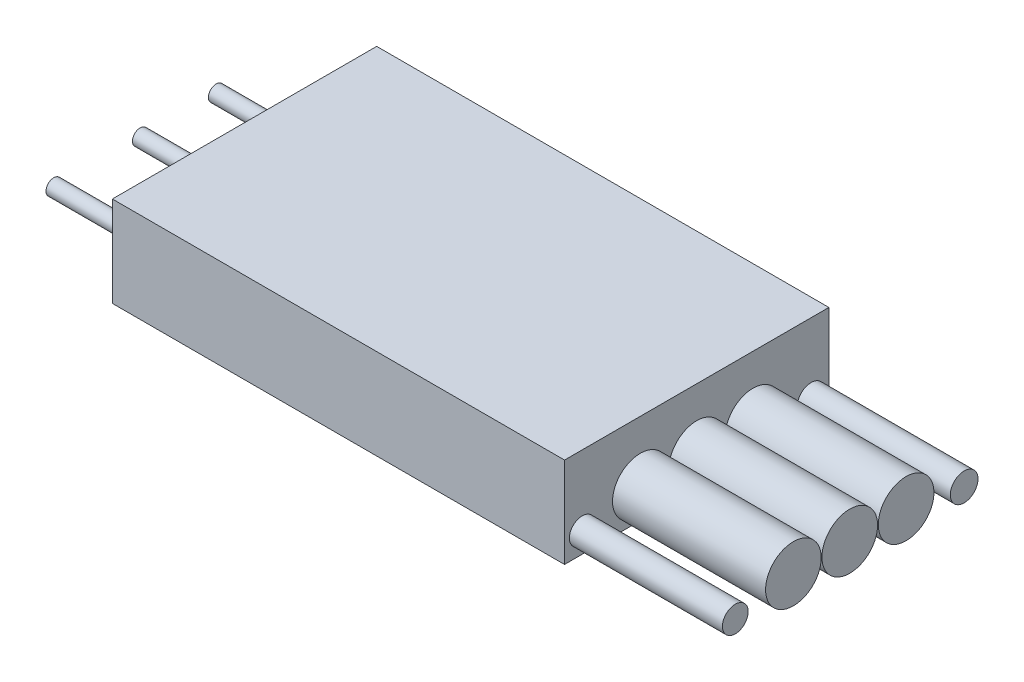
ISO-10303-21;
HEADER;
FILE_DESCRIPTION(('STEP AP214'),'2;1');
FILE_NAME('part.step','',(''),(''),'','','');
FILE_SCHEMA(('AUTOMOTIVE_DESIGN { 1 0 10303 214 1 1 1 1 }'));
ENDSEC;
DATA;
#1=APPLICATION_CONTEXT('core data for automotive mechanical design processes');
#2=APPLICATION_PROTOCOL_DEFINITION('international standard','automotive_design',2000,#1);
#3=PRODUCT_CONTEXT('',#1,'mechanical');
#4=PRODUCT('Part','Part','',(#3));
#5=PRODUCT_RELATED_PRODUCT_CATEGORY('part','',(#4));
#6=PRODUCT_DEFINITION_FORMATION('','',#4);
#7=PRODUCT_DEFINITION_CONTEXT('part definition',#1,'design');
#8=PRODUCT_DEFINITION('design','',#6,#7);
#9=PRODUCT_DEFINITION_SHAPE('','',#8);
#10=(LENGTH_UNIT() NAMED_UNIT(*) SI_UNIT(.MILLI.,.METRE.));
#11=(NAMED_UNIT(*) PLANE_ANGLE_UNIT() SI_UNIT($,.RADIAN.));
#12=(NAMED_UNIT(*) SI_UNIT($,.STERADIAN.) SOLID_ANGLE_UNIT());
#13=UNCERTAINTY_MEASURE_WITH_UNIT(LENGTH_MEASURE(1.E-05),#10,'distance_accuracy_value','');
#14=(GEOMETRIC_REPRESENTATION_CONTEXT(3) GLOBAL_UNCERTAINTY_ASSIGNED_CONTEXT((#13)) GLOBAL_UNIT_ASSIGNED_CONTEXT((#10,
#11,#12)) REPRESENTATION_CONTEXT('',''));
#15=CARTESIAN_POINT('',(0.,0.,0.));
#16=DIRECTION('',(0.,0.,1.));
#17=DIRECTION('',(1.,0.,0.));
#18=AXIS2_PLACEMENT_3D('',#15,#16,#17);
#19=CARTESIAN_POINT('',(65.,6.5,-19.));
#20=DIRECTION('',(0.,0.,-1.));
#21=DIRECTION('',(-1.,0.,0.));
#22=AXIS2_PLACEMENT_3D('',#19,#20,#21);
#23=PLANE('',#22);
#24=DIRECTION('',(0.,-1.,0.));
#25=VECTOR('',#24,1.);
#26=CARTESIAN_POINT('',(0.,6.5,-19.));
#27=LINE('',#26,#25);
#28=CARTESIAN_POINT('',(0.,6.5,-19.));
#29=VERTEX_POINT('',#28);
#30=CARTESIAN_POINT('',(0.,-6.5,-19.));
#31=VERTEX_POINT('',#30);
#32=EDGE_CURVE('E106',#29,#31,#27,.T.);
#33=ORIENTED_EDGE('',*,*,#32,.F.);
#34=DIRECTION('',(-1.,0.,0.));
#35=VECTOR('',#34,1.);
#36=CARTESIAN_POINT('',(65.,6.5,-19.));
#37=LINE('',#36,#35);
#38=CARTESIAN_POINT('',(65.,6.5,-19.));
#39=VERTEX_POINT('',#38);
#40=EDGE_CURVE('E53',#39,#29,#37,.T.);
#41=ORIENTED_EDGE('',*,*,#40,.F.);
#42=DIRECTION('',(0.,-1.,0.));
#43=VECTOR('',#42,1.);
#44=CARTESIAN_POINT('',(65.,6.5,-19.));
#45=LINE('',#44,#43);
#46=CARTESIAN_POINT('',(65.,-6.5,-19.));
#47=VERTEX_POINT('',#46);
#48=EDGE_CURVE('E100',#39,#47,#45,.T.);
#49=ORIENTED_EDGE('',*,*,#48,.T.);
#50=DIRECTION('',(-1.,0.,0.));
#51=VECTOR('',#50,1.);
#52=CARTESIAN_POINT('',(65.,-6.5,-19.));
#53=LINE('',#52,#51);
#54=EDGE_CURVE('E78',#47,#31,#53,.T.);
#55=ORIENTED_EDGE('',*,*,#54,.T.);
#56=EDGE_LOOP('',(#33,#41,#49,#55));
#57=FACE_BOUND('',#56,.T.);
#58=ADVANCED_FACE('F37',(#57),#23,.T.);
#59=CARTESIAN_POINT('',(65.,6.5,-19.));
#60=DIRECTION('',(0.,-1.,0.));
#61=DIRECTION('',(0.,0.,-1.));
#62=AXIS2_PLACEMENT_3D('',#59,#60,#61);
#63=PLANE('',#62);
#64=DIRECTION('',(0.,0.,1.));
#65=VECTOR('',#64,1.);
#66=CARTESIAN_POINT('',(0.,6.5,-19.));
#67=LINE('',#66,#65);
#68=CARTESIAN_POINT('',(0.,6.5,19.));
#69=VERTEX_POINT('',#68);
#70=EDGE_CURVE('E70',#29,#69,#67,.T.);
#71=ORIENTED_EDGE('',*,*,#70,.T.);
#72=DIRECTION('',(-1.,0.,0.));
#73=VECTOR('',#72,1.);
#74=CARTESIAN_POINT('',(65.,6.5,19.));
#75=LINE('',#74,#73);
#76=CARTESIAN_POINT('',(65.,6.5,19.));
#77=VERTEX_POINT('',#76);
#78=EDGE_CURVE('E97',#77,#69,#75,.T.);
#79=ORIENTED_EDGE('',*,*,#78,.F.);
#80=DIRECTION('',(0.,0.,1.));
#81=VECTOR('',#80,1.);
#82=CARTESIAN_POINT('',(65.,6.5,-19.));
#83=LINE('',#82,#81);
#84=EDGE_CURVE('E88',#39,#77,#83,.T.);
#85=ORIENTED_EDGE('',*,*,#84,.F.);
#86=ORIENTED_EDGE('',*,*,#40,.T.);
#87=EDGE_LOOP('',(#71,#79,#85,#86));
#88=FACE_BOUND('',#87,.T.);
#89=ADVANCED_FACE('F157',(#88),#63,.F.);
#90=CARTESIAN_POINT('',(65.,6.5,19.));
#91=DIRECTION('',(0.,0.,-1.));
#92=DIRECTION('',(-1.,0.,0.));
#93=AXIS2_PLACEMENT_3D('',#90,#91,#92);
#94=PLANE('',#93);
#95=DIRECTION('',(0.,-1.,0.));
#96=VECTOR('',#95,1.);
#97=CARTESIAN_POINT('',(0.,6.5,19.));
#98=LINE('',#97,#96);
#99=CARTESIAN_POINT('',(0.,-6.5,19.));
#100=VERTEX_POINT('',#99);
#101=EDGE_CURVE('E95',#69,#100,#98,.T.);
#102=ORIENTED_EDGE('',*,*,#101,.T.);
#103=DIRECTION('',(-1.,0.,0.));
#104=VECTOR('',#103,1.);
#105=CARTESIAN_POINT('',(65.,-6.5,19.));
#106=LINE('',#105,#104);
#107=CARTESIAN_POINT('',(65.,-6.5,19.));
#108=VERTEX_POINT('',#107);
#109=EDGE_CURVE('E92',#108,#100,#106,.T.);
#110=ORIENTED_EDGE('',*,*,#109,.F.);
#111=DIRECTION('',(0.,-1.,0.));
#112=VECTOR('',#111,1.);
#113=CARTESIAN_POINT('',(65.,6.5,19.));
#114=LINE('',#113,#112);
#115=EDGE_CURVE('E83',#77,#108,#114,.T.);
#116=ORIENTED_EDGE('',*,*,#115,.F.);
#117=ORIENTED_EDGE('',*,*,#78,.T.);
#118=EDGE_LOOP('',(#102,#110,#116,#117));
#119=FACE_BOUND('',#118,.T.);
#120=ADVANCED_FACE('F93',(#119),#94,.F.);
#121=CARTESIAN_POINT('',(65.,-6.5,-19.));
#122=DIRECTION('',(0.,-1.,0.));
#123=DIRECTION('',(0.,0.,-1.));
#124=AXIS2_PLACEMENT_3D('',#121,#122,#123);
#125=PLANE('',#124);
#126=DIRECTION('',(0.,0.,1.));
#127=VECTOR('',#126,1.);
#128=CARTESIAN_POINT('',(0.,-6.5,-19.));
#129=LINE('',#128,#127);
#130=EDGE_CURVE('E109',#31,#100,#129,.T.);
#131=ORIENTED_EDGE('',*,*,#130,.F.);
#132=ORIENTED_EDGE('',*,*,#54,.F.);
#133=DIRECTION('',(0.,0.,1.));
#134=VECTOR('',#133,1.);
#135=CARTESIAN_POINT('',(65.,-6.5,-19.));
#136=LINE('',#135,#134);
#137=EDGE_CURVE('E87',#47,#108,#136,.T.);
#138=ORIENTED_EDGE('',*,*,#137,.T.);
#139=ORIENTED_EDGE('',*,*,#109,.T.);
#140=EDGE_LOOP('',(#131,#132,#138,#139));
#141=FACE_BOUND('',#140,.T.);
#142=ADVANCED_FACE('F99',(#141),#125,.T.);
#143=CARTESIAN_POINT('',(65.,0.,0.));
#144=DIRECTION('',(-1.,0.,0.));
#145=DIRECTION('',(0.,0.,1.));
#146=AXIS2_PLACEMENT_3D('',#143,#144,#145);
#147=PLANE('',#146);
#148=CARTESIAN_POINT('',(65.,-3.56464945838489,-16.4442671514175));
#149=DIRECTION('',(-1.,0.,0.));
#150=DIRECTION('',(0.,0.,1.));
#151=AXIS2_PLACEMENT_3D('',#148,#149,#150);
#152=CIRCLE('',#151,1.99153023053248);
#153=CARTESIAN_POINT('',(65.,-3.56464945838489,-14.4527369208851));
#154=VERTEX_POINT('',#153);
#155=EDGE_CURVE('E11',#154,#154,#152,.F.);
#156=ORIENTED_EDGE('',*,*,#155,.F.);
#157=EDGE_LOOP('',(#156));
#158=FACE_BOUND('',#157,.T.);
#159=CARTESIAN_POINT('',(65.,-2.10071340201303,-8.1));
#160=DIRECTION('',(-1.,0.,0.));
#161=DIRECTION('',(0.,0.,1.));
#162=AXIS2_PLACEMENT_3D('',#159,#160,#161);
#163=CIRCLE('',#162,4.);
#164=CARTESIAN_POINT('',(65.,-2.10071340201303,-4.1));
#165=VERTEX_POINT('',#164);
#166=EDGE_CURVE('E45',#165,#165,#163,.F.);
#167=ORIENTED_EDGE('',*,*,#166,.F.);
#168=EDGE_LOOP('',(#167));
#169=FACE_BOUND('',#168,.T.);
#170=CARTESIAN_POINT('',(65.,-2.10071340201303,0.));
#171=DIRECTION('',(-1.,0.,0.));
#172=DIRECTION('',(0.,0.,1.));
#173=AXIS2_PLACEMENT_3D('',#170,#171,#172);
#174=CIRCLE('',#173,4.);
#175=CARTESIAN_POINT('',(65.,-2.10071340201303,4.));
#176=VERTEX_POINT('',#175);
#177=EDGE_CURVE('E123',#176,#176,#174,.F.);
#178=ORIENTED_EDGE('',*,*,#177,.F.);
#179=EDGE_LOOP('',(#178));
#180=FACE_BOUND('',#179,.T.);
#181=CARTESIAN_POINT('',(65.,-2.10071340201303,8.1));
#182=DIRECTION('',(-1.,0.,0.));
#183=DIRECTION('',(0.,0.,1.));
#184=AXIS2_PLACEMENT_3D('',#181,#182,#183);
#185=CIRCLE('',#184,4.);
#186=CARTESIAN_POINT('',(65.,-2.10071340201303,12.1));
#187=VERTEX_POINT('',#186);
#188=EDGE_CURVE('E120',#187,#187,#185,.F.);
#189=ORIENTED_EDGE('',*,*,#188,.F.);
#190=EDGE_LOOP('',(#189));
#191=FACE_BOUND('',#190,.T.);
#192=CARTESIAN_POINT('',(65.,-3.56464945838489,16.4552592238463));
#193=DIRECTION('',(-1.,0.,0.));
#194=DIRECTION('',(0.,0.,1.));
#195=AXIS2_PLACEMENT_3D('',#192,#193,#194);
#196=CIRCLE('',#195,1.84838134177481);
#197=CARTESIAN_POINT('',(65.,-3.56464945838489,18.3036405656211));
#198=VERTEX_POINT('',#197);
#199=EDGE_CURVE('E115',#198,#198,#196,.F.);
#200=ORIENTED_EDGE('',*,*,#199,.F.);
#201=EDGE_LOOP('',(#200));
#202=FACE_BOUND('',#201,.T.);
#203=ORIENTED_EDGE('',*,*,#48,.F.);
#204=ORIENTED_EDGE('',*,*,#84,.T.);
#205=ORIENTED_EDGE('',*,*,#115,.T.);
#206=ORIENTED_EDGE('',*,*,#137,.F.);
#207=EDGE_LOOP('',(#203,#204,#205,#206));
#208=FACE_BOUND('',#207,.T.);
#209=ADVANCED_FACE('F86',(#158,#169,#180,#191,#202,#208),#147,.F.);
#210=CARTESIAN_POINT('',(0.,0.,0.));
#211=DIRECTION('',(-1.,0.,0.));
#212=DIRECTION('',(0.,0.,1.));
#213=AXIS2_PLACEMENT_3D('',#210,#211,#212);
#214=PLANE('',#213);
#215=CARTESIAN_POINT('',(0.,-2.75861336611635,12.4202089258616));
#216=DIRECTION('',(-1.,0.,0.));
#217=DIRECTION('',(0.,0.,1.));
#218=AXIS2_PLACEMENT_3D('',#215,#216,#217);
#219=CIRCLE('',#218,1.11862450312621);
#220=CARTESIAN_POINT('',(0.,-2.75861336611635,13.5388334289878));
#221=VERTEX_POINT('',#220);
#222=EDGE_CURVE('E418',#221,#221,#219,.T.);
#223=ORIENTED_EDGE('',*,*,#222,.F.);
#224=EDGE_LOOP('',(#223));
#225=FACE_BOUND('',#224,.T.);
#226=CARTESIAN_POINT('',(0.,-2.75861336611635,0.));
#227=DIRECTION('',(-1.,0.,0.));
#228=DIRECTION('',(0.,0.,1.));
#229=AXIS2_PLACEMENT_3D('',#226,#227,#228);
#230=CIRCLE('',#229,1.11862450312621);
#231=CARTESIAN_POINT('',(0.,-2.75861336611635,1.11862450312621));
#232=VERTEX_POINT('',#231);
#233=EDGE_CURVE('E412',#232,#232,#230,.T.);
#234=ORIENTED_EDGE('',*,*,#233,.F.);
#235=EDGE_LOOP('',(#234));
#236=FACE_BOUND('',#235,.T.);
#237=CARTESIAN_POINT('',(0.,-2.75861336611635,-10.9266394980681));
#238=DIRECTION('',(-1.,0.,0.));
#239=DIRECTION('',(0.,0.,1.));
#240=AXIS2_PLACEMENT_3D('',#237,#238,#239);
#241=CIRCLE('',#240,1.11862450312621);
#242=CARTESIAN_POINT('',(0.,-2.75861336611635,-9.80801499494186));
#243=VERTEX_POINT('',#242);
#244=EDGE_CURVE('E409',#243,#243,#241,.T.);
#245=ORIENTED_EDGE('',*,*,#244,.F.);
#246=EDGE_LOOP('',(#245));
#247=FACE_BOUND('',#246,.T.);
#248=ORIENTED_EDGE('',*,*,#32,.T.);
#249=ORIENTED_EDGE('',*,*,#130,.T.);
#250=ORIENTED_EDGE('',*,*,#101,.F.);
#251=ORIENTED_EDGE('',*,*,#70,.F.);
#252=EDGE_LOOP('',(#248,#249,#250,#251));
#253=FACE_BOUND('',#252,.T.);
#254=ADVANCED_FACE('F132',(#225,#236,#247,#253),#214,.T.);
#255=CARTESIAN_POINT('',(87.,-3.56464945838489,16.4552592238463));
#256=DIRECTION('',(-1.,0.,0.));
#257=DIRECTION('',(0.,0.,1.));
#258=AXIS2_PLACEMENT_3D('',#255,#256,#257);
#259=CYLINDRICAL_SURFACE('',#258,1.84838134177481);
#260=CARTESIAN_POINT('',(87.,-3.56464945838489,16.4552592238463));
#261=DIRECTION('',(1.,0.,0.));
#262=DIRECTION('',(0.,0.,-1.));
#263=AXIS2_PLACEMENT_3D('',#260,#261,#262);
#264=CIRCLE('',#263,1.84838134177481);
#265=CARTESIAN_POINT('',(87.,-3.56464945838489,14.6068778820715));
#266=VERTEX_POINT('',#265);
#267=EDGE_CURVE('E110',#266,#266,#264,.T.);
#268=ORIENTED_EDGE('',*,*,#267,.F.);
#269=EDGE_LOOP('',(#268));
#270=FACE_BOUND('',#269,.T.);
#271=ORIENTED_EDGE('',*,*,#199,.T.);
#272=EDGE_LOOP('',(#271));
#273=FACE_BOUND('',#272,.T.);
#274=ADVANCED_FACE('F141',(#270,#273),#259,.T.);
#275=CARTESIAN_POINT('',(87.,0.,0.));
#276=DIRECTION('',(1.,0.,0.));
#277=DIRECTION('',(0.,0.,-1.));
#278=AXIS2_PLACEMENT_3D('',#275,#276,#277);
#279=PLANE('',#278);
#280=ORIENTED_EDGE('',*,*,#267,.T.);
#281=EDGE_LOOP('',(#280));
#282=FACE_BOUND('',#281,.T.);
#283=ADVANCED_FACE('F143',(#282),#279,.T.);
#284=CARTESIAN_POINT('',(87.,-2.10071340201303,8.1));
#285=DIRECTION('',(-1.,0.,0.));
#286=DIRECTION('',(0.,0.,1.));
#287=AXIS2_PLACEMENT_3D('',#284,#285,#286);
#288=CYLINDRICAL_SURFACE('',#287,4.);
#289=CARTESIAN_POINT('',(87.,-2.10071340201303,8.1));
#290=DIRECTION('',(1.,0.,0.));
#291=DIRECTION('',(0.,0.,-1.));
#292=AXIS2_PLACEMENT_3D('',#289,#290,#291);
#293=CIRCLE('',#292,4.);
#294=CARTESIAN_POINT('',(87.,-2.10071340201303,4.1));
#295=VERTEX_POINT('',#294);
#296=EDGE_CURVE('E395',#295,#295,#293,.T.);
#297=ORIENTED_EDGE('',*,*,#296,.F.);
#298=EDGE_LOOP('',(#297));
#299=FACE_BOUND('',#298,.T.);
#300=ORIENTED_EDGE('',*,*,#188,.T.);
#301=EDGE_LOOP('',(#300));
#302=FACE_BOUND('',#301,.T.);
#303=ADVANCED_FACE('F150',(#299,#302),#288,.T.);
#304=CARTESIAN_POINT('',(87.,0.,0.));
#305=DIRECTION('',(1.,0.,0.));
#306=DIRECTION('',(0.,0.,-1.));
#307=AXIS2_PLACEMENT_3D('',#304,#305,#306);
#308=PLANE('',#307);
#309=ORIENTED_EDGE('',*,*,#296,.T.);
#310=EDGE_LOOP('',(#309));
#311=FACE_BOUND('',#310,.T.);
#312=ADVANCED_FACE('F314',(#311),#308,.T.);
#313=CARTESIAN_POINT('',(87.,-2.10071340201303,0.));
#314=DIRECTION('',(-1.,0.,0.));
#315=DIRECTION('',(0.,0.,1.));
#316=AXIS2_PLACEMENT_3D('',#313,#314,#315);
#317=CYLINDRICAL_SURFACE('',#316,4.);
#318=CARTESIAN_POINT('',(87.,-2.10071340201303,0.));
#319=DIRECTION('',(1.,0.,0.));
#320=DIRECTION('',(0.,0.,-1.));
#321=AXIS2_PLACEMENT_3D('',#318,#319,#320);
#322=CIRCLE('',#321,4.);
#323=CARTESIAN_POINT('',(87.,-2.10071340201303,-4.));
#324=VERTEX_POINT('',#323);
#325=EDGE_CURVE('E396',#324,#324,#322,.T.);
#326=ORIENTED_EDGE('',*,*,#325,.F.);
#327=EDGE_LOOP('',(#326));
#328=FACE_BOUND('',#327,.T.);
#329=ORIENTED_EDGE('',*,*,#177,.T.);
#330=EDGE_LOOP('',(#329));
#331=FACE_BOUND('',#330,.T.);
#332=ADVANCED_FACE('F304',(#328,#331),#317,.T.);
#333=CARTESIAN_POINT('',(87.,0.,0.));
#334=DIRECTION('',(1.,0.,0.));
#335=DIRECTION('',(0.,0.,-1.));
#336=AXIS2_PLACEMENT_3D('',#333,#334,#335);
#337=PLANE('',#336);
#338=ORIENTED_EDGE('',*,*,#325,.T.);
#339=EDGE_LOOP('',(#338));
#340=FACE_BOUND('',#339,.T.);
#341=ADVANCED_FACE('F294',(#340),#337,.T.);
#342=CARTESIAN_POINT('',(87.,-2.10071340201303,-8.1));
#343=DIRECTION('',(-1.,0.,0.));
#344=DIRECTION('',(0.,0.,1.));
#345=AXIS2_PLACEMENT_3D('',#342,#343,#344);
#346=CYLINDRICAL_SURFACE('',#345,4.);
#347=CARTESIAN_POINT('',(87.,-2.10071340201303,-8.1));
#348=DIRECTION('',(1.,0.,0.));
#349=DIRECTION('',(0.,0.,-1.));
#350=AXIS2_PLACEMENT_3D('',#347,#348,#349);
#351=CIRCLE('',#350,4.);
#352=CARTESIAN_POINT('',(87.,-2.10071340201303,-12.1));
#353=VERTEX_POINT('',#352);
#354=EDGE_CURVE('E400',#353,#353,#351,.T.);
#355=ORIENTED_EDGE('',*,*,#354,.F.);
#356=EDGE_LOOP('',(#355));
#357=FACE_BOUND('',#356,.T.);
#358=ORIENTED_EDGE('',*,*,#166,.T.);
#359=EDGE_LOOP('',(#358));
#360=FACE_BOUND('',#359,.T.);
#361=ADVANCED_FACE('F128',(#357,#360),#346,.T.);
#362=CARTESIAN_POINT('',(87.,0.,0.));
#363=DIRECTION('',(1.,0.,0.));
#364=DIRECTION('',(0.,0.,-1.));
#365=AXIS2_PLACEMENT_3D('',#362,#363,#364);
#366=PLANE('',#365);
#367=ORIENTED_EDGE('',*,*,#354,.T.);
#368=EDGE_LOOP('',(#367));
#369=FACE_BOUND('',#368,.T.);
#370=ADVANCED_FACE('F276',(#369),#366,.T.);
#371=CARTESIAN_POINT('',(87.,-3.56464945838489,-16.4442671514175));
#372=DIRECTION('',(-1.,0.,0.));
#373=DIRECTION('',(0.,0.,1.));
#374=AXIS2_PLACEMENT_3D('',#371,#372,#373);
#375=CYLINDRICAL_SURFACE('',#374,1.99153023053248);
#376=CARTESIAN_POINT('',(87.,-3.56464945838489,-16.4442671514175));
#377=DIRECTION('',(1.,0.,0.));
#378=DIRECTION('',(0.,0.,-1.));
#379=AXIS2_PLACEMENT_3D('',#376,#377,#378);
#380=CIRCLE('',#379,1.99153023053248);
#381=CARTESIAN_POINT('',(87.,-3.56464945838489,-18.43579738195));
#382=VERTEX_POINT('',#381);
#383=EDGE_CURVE('E405',#382,#382,#380,.T.);
#384=ORIENTED_EDGE('',*,*,#383,.F.);
#385=EDGE_LOOP('',(#384));
#386=FACE_BOUND('',#385,.T.);
#387=ORIENTED_EDGE('',*,*,#155,.T.);
#388=EDGE_LOOP('',(#387));
#389=FACE_BOUND('',#388,.T.);
#390=ADVANCED_FACE('F267',(#386,#389),#375,.T.);
#391=CARTESIAN_POINT('',(87.,0.,0.));
#392=DIRECTION('',(1.,0.,0.));
#393=DIRECTION('',(0.,0.,-1.));
#394=AXIS2_PLACEMENT_3D('',#391,#392,#393);
#395=PLANE('',#394);
#396=ORIENTED_EDGE('',*,*,#383,.T.);
#397=EDGE_LOOP('',(#396));
#398=FACE_BOUND('',#397,.T.);
#399=ADVANCED_FACE('F188',(#398),#395,.T.);
#400=CARTESIAN_POINT('',(-15.,-2.75861336611635,-10.9266394980681));
#401=DIRECTION('',(1.,0.,0.));
#402=DIRECTION('',(0.,0.,-1.));
#403=AXIS2_PLACEMENT_3D('',#400,#401,#402);
#404=CYLINDRICAL_SURFACE('',#403,1.11862450312621);
#405=CARTESIAN_POINT('',(-15.,-2.75861336611635,-10.9266394980681));
#406=DIRECTION('',(-1.,0.,0.));
#407=DIRECTION('',(0.,0.,1.));
#408=AXIS2_PLACEMENT_3D('',#405,#406,#407);
#409=CIRCLE('',#408,1.11862450312621);
#410=CARTESIAN_POINT('',(-15.,-2.75861336611635,-9.80801499494186));
#411=VERTEX_POINT('',#410);
#412=EDGE_CURVE('E408',#411,#411,#409,.T.);
#413=ORIENTED_EDGE('',*,*,#412,.F.);
#414=EDGE_LOOP('',(#413));
#415=FACE_BOUND('',#414,.T.);
#416=ORIENTED_EDGE('',*,*,#244,.T.);
#417=EDGE_LOOP('',(#416));
#418=FACE_BOUND('',#417,.T.);
#419=ADVANCED_FACE('F193',(#415,#418),#404,.T.);
#420=CARTESIAN_POINT('',(-15.,-2.75861336611635,-10.9266394980681));
#421=DIRECTION('',(-1.,0.,0.));
#422=DIRECTION('',(0.,0.,1.));
#423=AXIS2_PLACEMENT_3D('',#420,#421,#422);
#424=PLANE('',#423);
#425=ORIENTED_EDGE('',*,*,#412,.T.);
#426=EDGE_LOOP('',(#425));
#427=FACE_BOUND('',#426,.T.);
#428=ADVANCED_FACE('F198',(#427),#424,.T.);
#429=CARTESIAN_POINT('',(-15.,-2.75861336611635,0.));
#430=DIRECTION('',(1.,0.,0.));
#431=DIRECTION('',(0.,0.,-1.));
#432=AXIS2_PLACEMENT_3D('',#429,#430,#431);
#433=CYLINDRICAL_SURFACE('',#432,1.11862450312621);
#434=CARTESIAN_POINT('',(-15.,-2.75861336611635,0.));
#435=DIRECTION('',(-1.,0.,0.));
#436=DIRECTION('',(0.,0.,1.));
#437=AXIS2_PLACEMENT_3D('',#434,#435,#436);
#438=CIRCLE('',#437,1.11862450312621);
#439=CARTESIAN_POINT('',(-15.,-2.75861336611635,1.11862450312621));
#440=VERTEX_POINT('',#439);
#441=EDGE_CURVE('E415',#440,#440,#438,.T.);
#442=ORIENTED_EDGE('',*,*,#441,.F.);
#443=EDGE_LOOP('',(#442));
#444=FACE_BOUND('',#443,.T.);
#445=ORIENTED_EDGE('',*,*,#233,.T.);
#446=EDGE_LOOP('',(#445));
#447=FACE_BOUND('',#446,.T.);
#448=ADVANCED_FACE('F209',(#444,#447),#433,.T.);
#449=CARTESIAN_POINT('',(-15.,-2.75861336611635,0.));
#450=DIRECTION('',(-1.,0.,0.));
#451=DIRECTION('',(0.,0.,1.));
#452=AXIS2_PLACEMENT_3D('',#449,#450,#451);
#453=PLANE('',#452);
#454=ORIENTED_EDGE('',*,*,#441,.T.);
#455=EDGE_LOOP('',(#454));
#456=FACE_BOUND('',#455,.T.);
#457=ADVANCED_FACE('F220',(#456),#453,.T.);
#458=CARTESIAN_POINT('',(-15.,-2.75861336611635,12.4202089258616));
#459=DIRECTION('',(1.,0.,0.));
#460=DIRECTION('',(0.,0.,-1.));
#461=AXIS2_PLACEMENT_3D('',#458,#459,#460);
#462=CYLINDRICAL_SURFACE('',#461,1.11862450312621);
#463=CARTESIAN_POINT('',(-15.,-2.75861336611635,12.4202089258616));
#464=DIRECTION('',(-1.,0.,0.));
#465=DIRECTION('',(0.,0.,1.));
#466=AXIS2_PLACEMENT_3D('',#463,#464,#465);
#467=CIRCLE('',#466,1.11862450312621);
#468=CARTESIAN_POINT('',(-15.,-2.75861336611635,13.5388334289878));
#469=VERTEX_POINT('',#468);
#470=EDGE_CURVE('E421',#469,#469,#467,.T.);
#471=ORIENTED_EDGE('',*,*,#470,.F.);
#472=EDGE_LOOP('',(#471));
#473=FACE_BOUND('',#472,.T.);
#474=ORIENTED_EDGE('',*,*,#222,.T.);
#475=EDGE_LOOP('',(#474));
#476=FACE_BOUND('',#475,.T.);
#477=ADVANCED_FACE('F231',(#473,#476),#462,.T.);
#478=CARTESIAN_POINT('',(-15.,-2.75861336611635,12.4202089258616));
#479=DIRECTION('',(-1.,0.,0.));
#480=DIRECTION('',(0.,0.,1.));
#481=AXIS2_PLACEMENT_3D('',#478,#479,#480);
#482=PLANE('',#481);
#483=ORIENTED_EDGE('',*,*,#470,.T.);
#484=EDGE_LOOP('',(#483));
#485=FACE_BOUND('',#484,.T.);
#486=ADVANCED_FACE('F242',(#485),#482,.T.);
#487=CLOSED_SHELL('',(#58,#89,#120,#142,#209,#254,#274,#283,#303,#312,#332,#341,#361,#370,#390,
#399,#419,#428,#448,#457,#477,#486));
#488=MANIFOLD_SOLID_BREP('B2',#487);
#489=ADVANCED_BREP_SHAPE_REPRESENTATION('',(#18,#488),#14);
#490=SHAPE_DEFINITION_REPRESENTATION(#9,#489);
ENDSEC;
END-ISO-10303-21;
